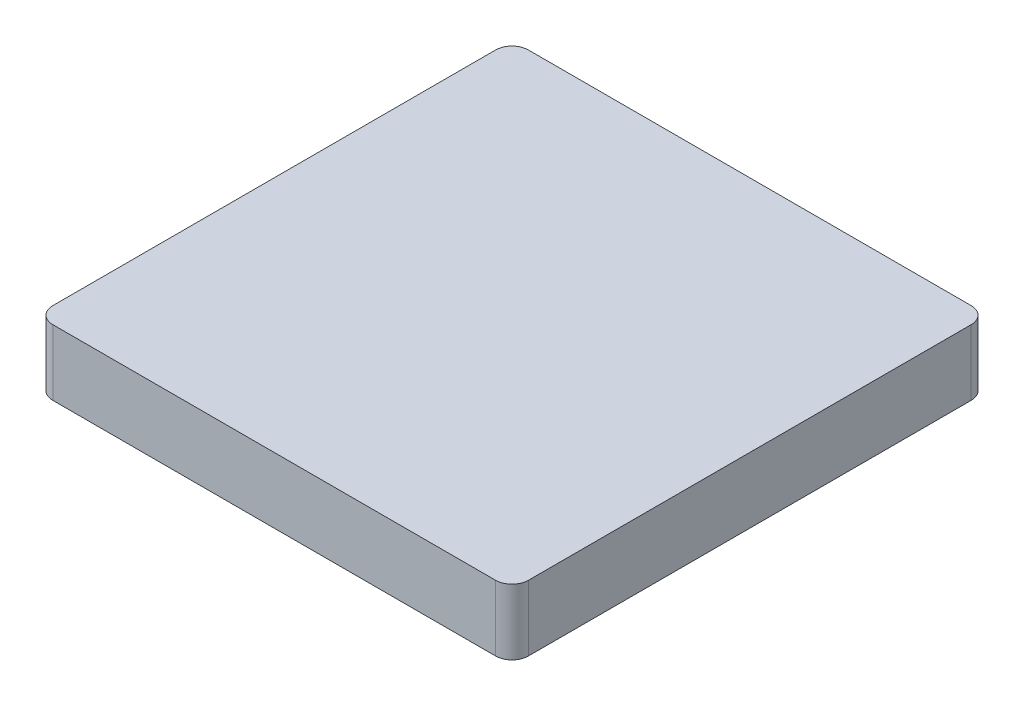
ISO-10303-21;
HEADER;
FILE_DESCRIPTION(('STEP AP214'),'2;1');
FILE_NAME('part.step','',(''),(''),'','','');
FILE_SCHEMA(('AUTOMOTIVE_DESIGN { 1 0 10303 214 1 1 1 1 }'));
ENDSEC;
DATA;
#1=APPLICATION_CONTEXT('core data for automotive mechanical design processes');
#2=APPLICATION_PROTOCOL_DEFINITION('international standard','automotive_design',2000,#1);
#3=PRODUCT_CONTEXT('',#1,'mechanical');
#4=PRODUCT('Part','Part','',(#3));
#5=PRODUCT_RELATED_PRODUCT_CATEGORY('part','',(#4));
#6=PRODUCT_DEFINITION_FORMATION('','',#4);
#7=PRODUCT_DEFINITION_CONTEXT('part definition',#1,'design');
#8=PRODUCT_DEFINITION('design','',#6,#7);
#9=PRODUCT_DEFINITION_SHAPE('','',#8);
#10=(LENGTH_UNIT() NAMED_UNIT(*) SI_UNIT(.MILLI.,.METRE.));
#11=(NAMED_UNIT(*) PLANE_ANGLE_UNIT() SI_UNIT($,.RADIAN.));
#12=(NAMED_UNIT(*) SI_UNIT($,.STERADIAN.) SOLID_ANGLE_UNIT());
#13=UNCERTAINTY_MEASURE_WITH_UNIT(LENGTH_MEASURE(1.E-05),#10,'distance_accuracy_value','');
#14=(GEOMETRIC_REPRESENTATION_CONTEXT(3) GLOBAL_UNCERTAINTY_ASSIGNED_CONTEXT((#13)) GLOBAL_UNIT_ASSIGNED_CONTEXT((#10,
#11,#12)) REPRESENTATION_CONTEXT('',''));
#15=CARTESIAN_POINT('',(0.,0.,0.));
#16=DIRECTION('',(0.,0.,1.));
#17=DIRECTION('',(1.,0.,0.));
#18=AXIS2_PLACEMENT_3D('',#15,#16,#17);
#19=CARTESIAN_POINT('',(-29.,8.,-29.));
#20=DIRECTION('',(1.,0.,0.));
#21=DIRECTION('',(0.,0.,-1.));
#22=AXIS2_PLACEMENT_3D('',#19,#20,#21);
#23=PLANE('',#22);
#24=DIRECTION('',(0.,0.,1.));
#25=VECTOR('',#24,1.);
#26=CARTESIAN_POINT('',(-29.,8.,-29.));
#27=LINE('',#26,#25);
#28=CARTESIAN_POINT('',(-29.,8.,-27.));
#29=VERTEX_POINT('',#28);
#30=CARTESIAN_POINT('',(-29.,8.,27.));
#31=VERTEX_POINT('',#30);
#32=EDGE_CURVE('E119',#29,#31,#27,.T.);
#33=ORIENTED_EDGE('',*,*,#32,.F.);
#34=DIRECTION('',(0.,-1.,0.));
#35=VECTOR('',#34,1.);
#36=CARTESIAN_POINT('',(-29.,8.,-27.));
#37=LINE('',#36,#35);
#38=CARTESIAN_POINT('',(-29.,0.,-27.));
#39=VERTEX_POINT('',#38);
#40=EDGE_CURVE('E104',#29,#39,#37,.T.);
#41=ORIENTED_EDGE('',*,*,#40,.T.);
#42=DIRECTION('',(0.,0.,1.));
#43=VECTOR('',#42,1.);
#44=CARTESIAN_POINT('',(-29.,0.,-29.));
#45=LINE('',#44,#43);
#46=CARTESIAN_POINT('',(-29.,0.,27.));
#47=VERTEX_POINT('',#46);
#48=EDGE_CURVE('E116',#39,#47,#45,.T.);
#49=ORIENTED_EDGE('',*,*,#48,.T.);
#50=DIRECTION('',(0.,-1.,0.));
#51=VECTOR('',#50,1.);
#52=CARTESIAN_POINT('',(-29.,8.,27.));
#53=LINE('',#52,#51);
#54=EDGE_CURVE('E121',#47,#31,#53,.F.);
#55=ORIENTED_EDGE('',*,*,#54,.T.);
#56=EDGE_LOOP('',(#33,#41,#49,#55));
#57=FACE_BOUND('',#56,.T.);
#58=ADVANCED_FACE('F34',(#57),#23,.F.);
#59=CARTESIAN_POINT('',(-29.,8.,29.));
#60=DIRECTION('',(0.,0.,-1.));
#61=DIRECTION('',(-1.,0.,0.));
#62=AXIS2_PLACEMENT_3D('',#59,#60,#61);
#63=PLANE('',#62);
#64=DIRECTION('',(1.,0.,0.));
#65=VECTOR('',#64,1.);
#66=CARTESIAN_POINT('',(-29.,0.,29.));
#67=LINE('',#66,#65);
#68=CARTESIAN_POINT('',(-27.,0.,29.));
#69=VERTEX_POINT('',#68);
#70=CARTESIAN_POINT('',(27.,0.,29.));
#71=VERTEX_POINT('',#70);
#72=EDGE_CURVE('E125',#69,#71,#67,.T.);
#73=ORIENTED_EDGE('',*,*,#72,.T.);
#74=DIRECTION('',(0.,-1.,0.));
#75=VECTOR('',#74,1.);
#76=CARTESIAN_POINT('',(27.,8.,29.));
#77=LINE('',#76,#75);
#78=CARTESIAN_POINT('',(27.,8.,29.));
#79=VERTEX_POINT('',#78);
#80=EDGE_CURVE('E11',#71,#79,#77,.F.);
#81=ORIENTED_EDGE('',*,*,#80,.T.);
#82=DIRECTION('',(1.,0.,0.));
#83=VECTOR('',#82,1.);
#84=CARTESIAN_POINT('',(-29.,8.,29.));
#85=LINE('',#84,#83);
#86=CARTESIAN_POINT('',(-27.,8.,29.));
#87=VERTEX_POINT('',#86);
#88=EDGE_CURVE('E161',#87,#79,#85,.T.);
#89=ORIENTED_EDGE('',*,*,#88,.F.);
#90=DIRECTION('',(0.,-1.,0.));
#91=VECTOR('',#90,1.);
#92=CARTESIAN_POINT('',(-27.,8.,29.));
#93=LINE('',#92,#91);
#94=EDGE_CURVE('E42',#87,#69,#93,.T.);
#95=ORIENTED_EDGE('',*,*,#94,.T.);
#96=EDGE_LOOP('',(#73,#81,#89,#95));
#97=FACE_BOUND('',#96,.T.);
#98=ADVANCED_FACE('F159',(#97),#63,.F.);
#99=CARTESIAN_POINT('',(29.,8.,-29.));
#100=DIRECTION('',(-1.,0.,0.));
#101=DIRECTION('',(0.,0.,1.));
#102=AXIS2_PLACEMENT_3D('',#99,#100,#101);
#103=PLANE('',#102);
#104=DIRECTION('',(0.,0.,-1.));
#105=VECTOR('',#104,1.);
#106=CARTESIAN_POINT('',(29.,0.,-29.));
#107=LINE('',#106,#105);
#108=CARTESIAN_POINT('',(29.,0.,27.));
#109=VERTEX_POINT('',#108);
#110=CARTESIAN_POINT('',(29.,0.,-27.));
#111=VERTEX_POINT('',#110);
#112=EDGE_CURVE('E128',#109,#111,#107,.T.);
#113=ORIENTED_EDGE('',*,*,#112,.T.);
#114=DIRECTION('',(0.,-1.,0.));
#115=VECTOR('',#114,1.);
#116=CARTESIAN_POINT('',(29.,8.,-27.));
#117=LINE('',#116,#115);
#118=CARTESIAN_POINT('',(29.,8.,-27.));
#119=VERTEX_POINT('',#118);
#120=EDGE_CURVE('E49',#111,#119,#117,.F.);
#121=ORIENTED_EDGE('',*,*,#120,.T.);
#122=DIRECTION('',(0.,0.,-1.));
#123=VECTOR('',#122,1.);
#124=CARTESIAN_POINT('',(29.,8.,-29.));
#125=LINE('',#124,#123);
#126=CARTESIAN_POINT('',(29.,8.,27.));
#127=VERTEX_POINT('',#126);
#128=EDGE_CURVE('E169',#127,#119,#125,.T.);
#129=ORIENTED_EDGE('',*,*,#128,.F.);
#130=DIRECTION('',(0.,-1.,0.));
#131=VECTOR('',#130,1.);
#132=CARTESIAN_POINT('',(29.,8.,27.));
#133=LINE('',#132,#131);
#134=EDGE_CURVE('E152',#127,#109,#133,.T.);
#135=ORIENTED_EDGE('',*,*,#134,.T.);
#136=EDGE_LOOP('',(#113,#121,#129,#135));
#137=FACE_BOUND('',#136,.T.);
#138=ADVANCED_FACE('F168',(#137),#103,.F.);
#139=CARTESIAN_POINT('',(-29.,8.,-29.));
#140=DIRECTION('',(0.,0.,1.));
#141=DIRECTION('',(1.,0.,0.));
#142=AXIS2_PLACEMENT_3D('',#139,#140,#141);
#143=PLANE('',#142);
#144=DIRECTION('',(-1.,0.,0.));
#145=VECTOR('',#144,1.);
#146=CARTESIAN_POINT('',(-29.,0.,-29.));
#147=LINE('',#146,#145);
#148=CARTESIAN_POINT('',(27.,0.,-29.));
#149=VERTEX_POINT('',#148);
#150=CARTESIAN_POINT('',(-27.,0.,-29.));
#151=VERTEX_POINT('',#150);
#152=EDGE_CURVE('E135',#149,#151,#147,.T.);
#153=ORIENTED_EDGE('',*,*,#152,.T.);
#154=DIRECTION('',(0.,-1.,0.));
#155=VECTOR('',#154,1.);
#156=CARTESIAN_POINT('',(-27.,8.,-29.));
#157=LINE('',#156,#155);
#158=CARTESIAN_POINT('',(-27.,8.,-29.));
#159=VERTEX_POINT('',#158);
#160=EDGE_CURVE('E105',#151,#159,#157,.F.);
#161=ORIENTED_EDGE('',*,*,#160,.T.);
#162=DIRECTION('',(-1.,0.,0.));
#163=VECTOR('',#162,1.);
#164=CARTESIAN_POINT('',(-29.,8.,-29.));
#165=LINE('',#164,#163);
#166=CARTESIAN_POINT('',(27.,8.,-29.));
#167=VERTEX_POINT('',#166);
#168=EDGE_CURVE('E131',#167,#159,#165,.T.);
#169=ORIENTED_EDGE('',*,*,#168,.F.);
#170=DIRECTION('',(0.,-1.,0.));
#171=VECTOR('',#170,1.);
#172=CARTESIAN_POINT('',(27.,8.,-29.));
#173=LINE('',#172,#171);
#174=EDGE_CURVE('E110',#167,#149,#173,.T.);
#175=ORIENTED_EDGE('',*,*,#174,.T.);
#176=EDGE_LOOP('',(#153,#161,#169,#175));
#177=FACE_BOUND('',#176,.T.);
#178=ADVANCED_FACE('F197',(#177),#143,.F.);
#179=CARTESIAN_POINT('',(0.,8.,0.));
#180=DIRECTION('',(0.,1.,0.));
#181=DIRECTION('',(0.,0.,1.));
#182=AXIS2_PLACEMENT_3D('',#179,#180,#181);
#183=PLANE('',#182);
#184=ORIENTED_EDGE('',*,*,#168,.T.);
#185=CARTESIAN_POINT('',(-27.,8.,-27.));
#186=DIRECTION('',(0.,1.,0.));
#187=DIRECTION('',(0.,0.,1.));
#188=AXIS2_PLACEMENT_3D('',#185,#186,#187);
#189=CIRCLE('',#188,2.);
#190=EDGE_CURVE('E150',#159,#29,#189,.T.);
#191=ORIENTED_EDGE('',*,*,#190,.T.);
#192=ORIENTED_EDGE('',*,*,#32,.T.);
#193=CARTESIAN_POINT('',(-27.,8.,27.));
#194=DIRECTION('',(0.,1.,0.));
#195=DIRECTION('',(0.,0.,1.));
#196=AXIS2_PLACEMENT_3D('',#193,#194,#195);
#197=CIRCLE('',#196,2.);
#198=EDGE_CURVE('E145',#31,#87,#197,.T.);
#199=ORIENTED_EDGE('',*,*,#198,.T.);
#200=ORIENTED_EDGE('',*,*,#88,.T.);
#201=CARTESIAN_POINT('',(27.,8.,27.));
#202=DIRECTION('',(0.,1.,0.));
#203=DIRECTION('',(0.,0.,1.));
#204=AXIS2_PLACEMENT_3D('',#201,#202,#203);
#205=CIRCLE('',#204,2.);
#206=EDGE_CURVE('E56',#79,#127,#205,.T.);
#207=ORIENTED_EDGE('',*,*,#206,.T.);
#208=ORIENTED_EDGE('',*,*,#128,.T.);
#209=CARTESIAN_POINT('',(27.,8.,-27.));
#210=DIRECTION('',(0.,1.,0.));
#211=DIRECTION('',(0.,0.,1.));
#212=AXIS2_PLACEMENT_3D('',#209,#210,#211);
#213=CIRCLE('',#212,2.);
#214=EDGE_CURVE('E148',#119,#167,#213,.T.);
#215=ORIENTED_EDGE('',*,*,#214,.T.);
#216=EDGE_LOOP('',(#184,#191,#192,#199,#200,#207,#208,#215));
#217=FACE_BOUND('',#216,.T.);
#218=ADVANCED_FACE('F174',(#217),#183,.T.);
#219=CARTESIAN_POINT('',(0.,0.,0.));
#220=DIRECTION('',(0.,1.,0.));
#221=DIRECTION('',(0.,0.,1.));
#222=AXIS2_PLACEMENT_3D('',#219,#220,#221);
#223=PLANE('',#222);
#224=ORIENTED_EDGE('',*,*,#48,.F.);
#225=CARTESIAN_POINT('',(-27.,0.,-27.));
#226=DIRECTION('',(0.,1.,0.));
#227=DIRECTION('',(0.,0.,1.));
#228=AXIS2_PLACEMENT_3D('',#225,#226,#227);
#229=CIRCLE('',#228,2.);
#230=EDGE_CURVE('E100',#39,#151,#229,.F.);
#231=ORIENTED_EDGE('',*,*,#230,.T.);
#232=ORIENTED_EDGE('',*,*,#152,.F.);
#233=CARTESIAN_POINT('',(27.,0.,-27.));
#234=DIRECTION('',(0.,1.,0.));
#235=DIRECTION('',(0.,0.,1.));
#236=AXIS2_PLACEMENT_3D('',#233,#234,#235);
#237=CIRCLE('',#236,2.);
#238=EDGE_CURVE('E111',#149,#111,#237,.F.);
#239=ORIENTED_EDGE('',*,*,#238,.T.);
#240=ORIENTED_EDGE('',*,*,#112,.F.);
#241=CARTESIAN_POINT('',(27.,0.,27.));
#242=DIRECTION('',(0.,1.,0.));
#243=DIRECTION('',(0.,0.,1.));
#244=AXIS2_PLACEMENT_3D('',#241,#242,#243);
#245=CIRCLE('',#244,2.);
#246=EDGE_CURVE('E139',#109,#71,#245,.F.);
#247=ORIENTED_EDGE('',*,*,#246,.T.);
#248=ORIENTED_EDGE('',*,*,#72,.F.);
#249=CARTESIAN_POINT('',(-27.,0.,27.));
#250=DIRECTION('',(0.,1.,0.));
#251=DIRECTION('',(0.,0.,1.));
#252=AXIS2_PLACEMENT_3D('',#249,#250,#251);
#253=CIRCLE('',#252,2.);
#254=EDGE_CURVE('E120',#69,#47,#253,.F.);
#255=ORIENTED_EDGE('',*,*,#254,.T.);
#256=EDGE_LOOP('',(#224,#231,#232,#239,#240,#247,#248,#255));
#257=FACE_BOUND('',#256,.T.);
#258=ADVANCED_FACE('F123',(#257),#223,.F.);
#259=CARTESIAN_POINT('',(-27.,8.,-27.));
#260=DIRECTION('',(0.,-1.,0.));
#261=DIRECTION('',(0.,0.,-1.));
#262=AXIS2_PLACEMENT_3D('',#259,#260,#261);
#263=CYLINDRICAL_SURFACE('',#262,2.);
#264=ORIENTED_EDGE('',*,*,#190,.F.);
#265=ORIENTED_EDGE('',*,*,#160,.F.);
#266=ORIENTED_EDGE('',*,*,#230,.F.);
#267=ORIENTED_EDGE('',*,*,#40,.F.);
#268=EDGE_LOOP('',(#264,#265,#266,#267));
#269=FACE_BOUND('',#268,.T.);
#270=ADVANCED_FACE('F103',(#269),#263,.T.);
#271=CARTESIAN_POINT('',(27.,8.,-27.));
#272=DIRECTION('',(0.,-1.,0.));
#273=DIRECTION('',(0.,0.,-1.));
#274=AXIS2_PLACEMENT_3D('',#271,#272,#273);
#275=CYLINDRICAL_SURFACE('',#274,2.);
#276=ORIENTED_EDGE('',*,*,#214,.F.);
#277=ORIENTED_EDGE('',*,*,#120,.F.);
#278=ORIENTED_EDGE('',*,*,#238,.F.);
#279=ORIENTED_EDGE('',*,*,#174,.F.);
#280=EDGE_LOOP('',(#276,#277,#278,#279));
#281=FACE_BOUND('',#280,.T.);
#282=ADVANCED_FACE('F179',(#281),#275,.T.);
#283=CARTESIAN_POINT('',(27.,8.,27.));
#284=DIRECTION('',(0.,-1.,0.));
#285=DIRECTION('',(0.,0.,-1.));
#286=AXIS2_PLACEMENT_3D('',#283,#284,#285);
#287=CYLINDRICAL_SURFACE('',#286,2.);
#288=ORIENTED_EDGE('',*,*,#206,.F.);
#289=ORIENTED_EDGE('',*,*,#80,.F.);
#290=ORIENTED_EDGE('',*,*,#246,.F.);
#291=ORIENTED_EDGE('',*,*,#134,.F.);
#292=EDGE_LOOP('',(#288,#289,#290,#291));
#293=FACE_BOUND('',#292,.T.);
#294=ADVANCED_FACE('F167',(#293),#287,.T.);
#295=CARTESIAN_POINT('',(-27.,8.,27.));
#296=DIRECTION('',(0.,-1.,0.));
#297=DIRECTION('',(0.,0.,-1.));
#298=AXIS2_PLACEMENT_3D('',#295,#296,#297);
#299=CYLINDRICAL_SURFACE('',#298,2.);
#300=ORIENTED_EDGE('',*,*,#198,.F.);
#301=ORIENTED_EDGE('',*,*,#54,.F.);
#302=ORIENTED_EDGE('',*,*,#254,.F.);
#303=ORIENTED_EDGE('',*,*,#94,.F.);
#304=EDGE_LOOP('',(#300,#301,#302,#303));
#305=FACE_BOUND('',#304,.T.);
#306=ADVANCED_FACE('F36',(#305),#299,.T.);
#307=CLOSED_SHELL('',(#58,#98,#138,#178,#218,#258,#270,#282,#294,#306));
#308=MANIFOLD_SOLID_BREP('B2',#307);
#309=ADVANCED_BREP_SHAPE_REPRESENTATION('',(#18,#308),#14);
#310=SHAPE_DEFINITION_REPRESENTATION(#9,#309);
ENDSEC;
END-ISO-10303-21;
